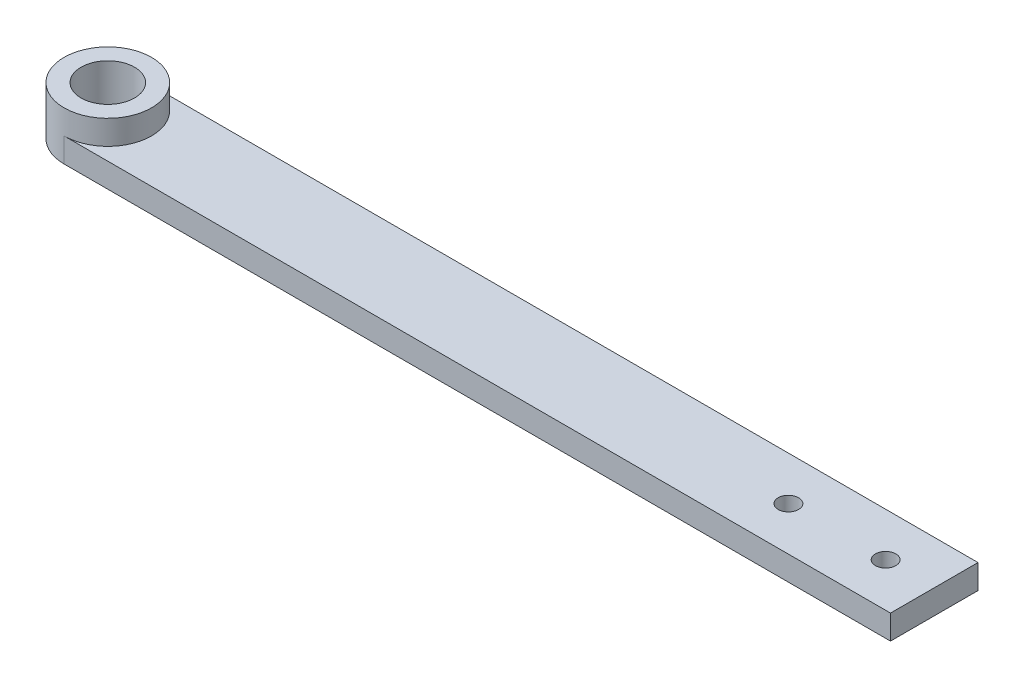
ISO-10303-21;
HEADER;
FILE_DESCRIPTION(('STEP AP214'),'2;1');
FILE_NAME('part.step','',(''),(''),'','','');
FILE_SCHEMA(('AUTOMOTIVE_DESIGN { 1 0 10303 214 1 1 1 1 }'));
ENDSEC;
DATA;
#1=APPLICATION_CONTEXT('core data for automotive mechanical design processes');
#2=APPLICATION_PROTOCOL_DEFINITION('international standard','automotive_design',2000,#1);
#3=PRODUCT_CONTEXT('',#1,'mechanical');
#4=PRODUCT('Part','Part','',(#3));
#5=PRODUCT_RELATED_PRODUCT_CATEGORY('part','',(#4));
#6=PRODUCT_DEFINITION_FORMATION('','',#4);
#7=PRODUCT_DEFINITION_CONTEXT('part definition',#1,'design');
#8=PRODUCT_DEFINITION('design','',#6,#7);
#9=PRODUCT_DEFINITION_SHAPE('','',#8);
#10=(LENGTH_UNIT() NAMED_UNIT(*) SI_UNIT(.MILLI.,.METRE.));
#11=(NAMED_UNIT(*) PLANE_ANGLE_UNIT() SI_UNIT($,.RADIAN.));
#12=(NAMED_UNIT(*) SI_UNIT($,.STERADIAN.) SOLID_ANGLE_UNIT());
#13=UNCERTAINTY_MEASURE_WITH_UNIT(LENGTH_MEASURE(1.E-05),#10,'distance_accuracy_value','');
#14=(GEOMETRIC_REPRESENTATION_CONTEXT(3) GLOBAL_UNCERTAINTY_ASSIGNED_CONTEXT((#13)) GLOBAL_UNIT_ASSIGNED_CONTEXT((#10,
#11,#12)) REPRESENTATION_CONTEXT('',''));
#15=CARTESIAN_POINT('',(0.,0.,0.));
#16=DIRECTION('',(0.,0.,1.));
#17=DIRECTION('',(1.,0.,0.));
#18=AXIS2_PLACEMENT_3D('',#15,#16,#17);
#19=CARTESIAN_POINT('',(0.,5.,18.));
#20=DIRECTION('',(-1.,0.,0.));
#21=DIRECTION('',(0.,0.,1.));
#22=AXIS2_PLACEMENT_3D('',#19,#20,#21);
#23=PLANE('',#22);
#24=DIRECTION('',(0.,0.,-1.));
#25=VECTOR('',#24,1.);
#26=CARTESIAN_POINT('',(0.,0.,18.));
#27=LINE('',#26,#25);
#28=CARTESIAN_POINT('',(0.,0.,18.));
#29=VERTEX_POINT('',#28);
#30=CARTESIAN_POINT('',(0.,0.,0.));
#31=VERTEX_POINT('',#30);
#32=EDGE_CURVE('E113',#29,#31,#27,.T.);
#33=ORIENTED_EDGE('',*,*,#32,.T.);
#34=DIRECTION('',(0.,-1.,0.));
#35=VECTOR('',#34,1.);
#36=CARTESIAN_POINT('',(0.,5.,0.));
#37=LINE('',#36,#35);
#38=CARTESIAN_POINT('',(0.,5.,0.));
#39=VERTEX_POINT('',#38);
#40=EDGE_CURVE('E11',#39,#31,#37,.T.);
#41=ORIENTED_EDGE('',*,*,#40,.F.);
#42=DIRECTION('',(0.,0.,-1.));
#43=VECTOR('',#42,1.);
#44=CARTESIAN_POINT('',(0.,5.,18.));
#45=LINE('',#44,#43);
#46=CARTESIAN_POINT('',(0.,5.,18.));
#47=VERTEX_POINT('',#46);
#48=EDGE_CURVE('E120',#47,#39,#45,.T.);
#49=ORIENTED_EDGE('',*,*,#48,.F.);
#50=DIRECTION('',(0.,-1.,0.));
#51=VECTOR('',#50,1.);
#52=CARTESIAN_POINT('',(0.,5.,18.));
#53=LINE('',#52,#51);
#54=EDGE_CURVE('E95',#47,#29,#53,.T.);
#55=ORIENTED_EDGE('',*,*,#54,.T.);
#56=EDGE_LOOP('',(#33,#41,#49,#55));
#57=FACE_BOUND('',#56,.T.);
#58=ADVANCED_FACE('F45',(#57),#23,.F.);
#59=CARTESIAN_POINT('',(0.,5.,0.));
#60=DIRECTION('',(0.,0.,1.));
#61=DIRECTION('',(1.,0.,0.));
#62=AXIS2_PLACEMENT_3D('',#59,#60,#61);
#63=PLANE('',#62);
#64=DIRECTION('',(-1.,0.,0.));
#65=VECTOR('',#64,1.);
#66=CARTESIAN_POINT('',(0.,0.,0.));
#67=LINE('',#66,#65);
#68=CARTESIAN_POINT('',(-170.,0.,0.));
#69=VERTEX_POINT('',#68);
#70=EDGE_CURVE('E128',#31,#69,#67,.T.);
#71=ORIENTED_EDGE('',*,*,#70,.T.);
#72=DIRECTION('',(0.,-1.,0.));
#73=VECTOR('',#72,1.);
#74=CARTESIAN_POINT('',(-170.,5.,0.));
#75=LINE('',#74,#73);
#76=CARTESIAN_POINT('',(-170.,5.,0.));
#77=VERTEX_POINT('',#76);
#78=EDGE_CURVE('E54',#77,#69,#75,.T.);
#79=ORIENTED_EDGE('',*,*,#78,.F.);
#80=DIRECTION('',(-1.,0.,0.));
#81=VECTOR('',#80,1.);
#82=CARTESIAN_POINT('',(0.,5.,0.));
#83=LINE('',#82,#81);
#84=EDGE_CURVE('E91',#39,#77,#83,.T.);
#85=ORIENTED_EDGE('',*,*,#84,.F.);
#86=ORIENTED_EDGE('',*,*,#40,.T.);
#87=EDGE_LOOP('',(#71,#79,#85,#86));
#88=FACE_BOUND('',#87,.T.);
#89=ADVANCED_FACE('F142',(#88),#63,.F.);
#90=CARTESIAN_POINT('',(-170.,5.,9.00000000000002));
#91=DIRECTION('',(0.,-1.,0.));
#92=DIRECTION('',(0.,0.,-1.));
#93=AXIS2_PLACEMENT_3D('',#90,#91,#92);
#94=CYLINDRICAL_SURFACE('',#93,9.);
#95=CARTESIAN_POINT('',(-170.,0.,9.00000000000002));
#96=DIRECTION('',(0.,1.,0.));
#97=DIRECTION('',(0.,0.,1.));
#98=AXIS2_PLACEMENT_3D('',#95,#96,#97);
#99=CIRCLE('',#98,9.);
#100=CARTESIAN_POINT('',(-170.,0.,18.));
#101=VERTEX_POINT('',#100);
#102=EDGE_CURVE('E81',#69,#101,#99,.T.);
#103=ORIENTED_EDGE('',*,*,#102,.T.);
#104=DIRECTION('',(0.,-1.,0.));
#105=VECTOR('',#104,1.);
#106=CARTESIAN_POINT('',(-170.,5.,18.));
#107=LINE('',#106,#105);
#108=CARTESIAN_POINT('',(-170.,5.,18.));
#109=VERTEX_POINT('',#108);
#110=EDGE_CURVE('E94',#109,#101,#107,.T.);
#111=ORIENTED_EDGE('',*,*,#110,.F.);
#112=CARTESIAN_POINT('',(-170.,5.,9.00000000000002));
#113=DIRECTION('',(0.,1.,0.));
#114=DIRECTION('',(0.,0.,1.));
#115=AXIS2_PLACEMENT_3D('',#112,#113,#114);
#116=CIRCLE('',#115,8.99999999999998);
#117=EDGE_CURVE('E102',#109,#77,#116,.T.);
#118=ORIENTED_EDGE('',*,*,#117,.T.);
#119=ORIENTED_EDGE('',*,*,#78,.T.);
#120=EDGE_LOOP('',(#103,#111,#118,#119));
#121=FACE_BOUND('',#120,.T.);
#122=CARTESIAN_POINT('',(-170.,10.,9.00000000000002));
#123=DIRECTION('',(0.,1.,0.));
#124=DIRECTION('',(0.,0.,1.));
#125=AXIS2_PLACEMENT_3D('',#122,#123,#124);
#126=CIRCLE('',#125,8.99999999999998);
#127=CARTESIAN_POINT('',(-170.,10.,18.));
#128=VERTEX_POINT('',#127);
#129=EDGE_CURVE('E107',#128,#128,#126,.T.);
#130=ORIENTED_EDGE('',*,*,#129,.F.);
#131=EDGE_LOOP('',(#130));
#132=FACE_BOUND('',#131,.T.);
#133=ADVANCED_FACE('F100',(#121,#132),#94,.T.);
#134=CARTESIAN_POINT('',(-170.,5.,18.));
#135=DIRECTION('',(0.,0.,-1.));
#136=DIRECTION('',(-1.,0.,0.));
#137=AXIS2_PLACEMENT_3D('',#134,#135,#136);
#138=PLANE('',#137);
#139=DIRECTION('',(1.,0.,0.));
#140=VECTOR('',#139,1.);
#141=CARTESIAN_POINT('',(-170.,0.,18.));
#142=LINE('',#141,#140);
#143=EDGE_CURVE('E86',#101,#29,#142,.T.);
#144=ORIENTED_EDGE('',*,*,#143,.T.);
#145=ORIENTED_EDGE('',*,*,#54,.F.);
#146=DIRECTION('',(1.,0.,0.));
#147=VECTOR('',#146,1.);
#148=CARTESIAN_POINT('',(-170.,5.,18.));
#149=LINE('',#148,#147);
#150=EDGE_CURVE('E62',#109,#47,#149,.T.);
#151=ORIENTED_EDGE('',*,*,#150,.F.);
#152=ORIENTED_EDGE('',*,*,#110,.T.);
#153=EDGE_LOOP('',(#144,#145,#151,#152));
#154=FACE_BOUND('',#153,.T.);
#155=ADVANCED_FACE('F93',(#154),#138,.F.);
#156=CARTESIAN_POINT('',(-170.,5.,9.00000000000002));
#157=DIRECTION('',(0.,1.,0.));
#158=DIRECTION('',(0.,0.,1.));
#159=AXIS2_PLACEMENT_3D('',#156,#157,#158);
#160=PLANE('',#159);
#161=CARTESIAN_POINT('',(-10.,5.,9.));
#162=DIRECTION('',(0.,1.,0.));
#163=DIRECTION('',(0.,0.,1.));
#164=AXIS2_PLACEMENT_3D('',#161,#162,#163);
#165=CIRCLE('',#164,2.1);
#166=CARTESIAN_POINT('',(-10.,5.,11.1));
#167=VERTEX_POINT('',#166);
#168=EDGE_CURVE('E181',#167,#167,#165,.T.);
#169=ORIENTED_EDGE('',*,*,#168,.F.);
#170=EDGE_LOOP('',(#169));
#171=FACE_BOUND('',#170,.T.);
#172=CARTESIAN_POINT('',(-30.,5.,9.));
#173=DIRECTION('',(0.,1.,0.));
#174=DIRECTION('',(0.,0.,1.));
#175=AXIS2_PLACEMENT_3D('',#172,#173,#174);
#176=CIRCLE('',#175,2.1);
#177=CARTESIAN_POINT('',(-30.,5.,11.1));
#178=VERTEX_POINT('',#177);
#179=EDGE_CURVE('E183',#178,#178,#176,.T.);
#180=ORIENTED_EDGE('',*,*,#179,.F.);
#181=EDGE_LOOP('',(#180));
#182=FACE_BOUND('',#181,.T.);
#183=ORIENTED_EDGE('',*,*,#117,.F.);
#184=ORIENTED_EDGE('',*,*,#150,.T.);
#185=ORIENTED_EDGE('',*,*,#48,.T.);
#186=ORIENTED_EDGE('',*,*,#84,.T.);
#187=EDGE_LOOP('',(#183,#184,#185,#186));
#188=FACE_BOUND('',#187,.T.);
#189=ADVANCED_FACE('F105',(#171,#182,#188),#160,.T.);
#190=CARTESIAN_POINT('',(-170.,0.,9.00000000000002));
#191=DIRECTION('',(0.,1.,0.));
#192=DIRECTION('',(0.,0.,1.));
#193=AXIS2_PLACEMENT_3D('',#190,#191,#192);
#194=PLANE('',#193);
#195=CARTESIAN_POINT('',(-10.,0.,9.));
#196=DIRECTION('',(0.,1.,0.));
#197=DIRECTION('',(0.,0.,1.));
#198=AXIS2_PLACEMENT_3D('',#195,#196,#197);
#199=CIRCLE('',#198,2.1);
#200=CARTESIAN_POINT('',(-10.,0.,11.1));
#201=VERTEX_POINT('',#200);
#202=EDGE_CURVE('E178',#201,#201,#199,.T.);
#203=ORIENTED_EDGE('',*,*,#202,.T.);
#204=EDGE_LOOP('',(#203));
#205=FACE_BOUND('',#204,.T.);
#206=CARTESIAN_POINT('',(-30.,0.,9.));
#207=DIRECTION('',(0.,1.,0.));
#208=DIRECTION('',(0.,0.,1.));
#209=AXIS2_PLACEMENT_3D('',#206,#207,#208);
#210=CIRCLE('',#209,2.1);
#211=CARTESIAN_POINT('',(-30.,0.,11.1));
#212=VERTEX_POINT('',#211);
#213=EDGE_CURVE('E189',#212,#212,#210,.T.);
#214=ORIENTED_EDGE('',*,*,#213,.T.);
#215=EDGE_LOOP('',(#214));
#216=FACE_BOUND('',#215,.T.);
#217=CARTESIAN_POINT('',(-170.,0.,9.00000000000002));
#218=DIRECTION('',(0.,1.,0.));
#219=DIRECTION('',(0.,0.,1.));
#220=AXIS2_PLACEMENT_3D('',#217,#218,#219);
#221=CIRCLE('',#220,5.50000000000002);
#222=CARTESIAN_POINT('',(-170.,0.,14.5));
#223=VERTEX_POINT('',#222);
#224=EDGE_CURVE('E108',#223,#223,#221,.T.);
#225=ORIENTED_EDGE('',*,*,#224,.T.);
#226=EDGE_LOOP('',(#225));
#227=FACE_BOUND('',#226,.T.);
#228=ORIENTED_EDGE('',*,*,#32,.F.);
#229=ORIENTED_EDGE('',*,*,#143,.F.);
#230=ORIENTED_EDGE('',*,*,#102,.F.);
#231=ORIENTED_EDGE('',*,*,#70,.F.);
#232=EDGE_LOOP('',(#228,#229,#230,#231));
#233=FACE_BOUND('',#232,.T.);
#234=ADVANCED_FACE('F139',(#205,#216,#227,#233),#194,.F.);
#235=CARTESIAN_POINT('',(-170.,10.,9.00000000000002));
#236=DIRECTION('',(0.,1.,0.));
#237=DIRECTION('',(0.,0.,1.));
#238=AXIS2_PLACEMENT_3D('',#235,#236,#237);
#239=PLANE('',#238);
#240=CARTESIAN_POINT('',(-170.,10.,9.00000000000002));
#241=DIRECTION('',(0.,1.,0.));
#242=DIRECTION('',(0.,0.,1.));
#243=AXIS2_PLACEMENT_3D('',#240,#241,#242);
#244=CIRCLE('',#243,5.50000000000002);
#245=CARTESIAN_POINT('',(-170.,10.,14.5));
#246=VERTEX_POINT('',#245);
#247=EDGE_CURVE('E116',#246,#246,#244,.T.);
#248=ORIENTED_EDGE('',*,*,#247,.F.);
#249=EDGE_LOOP('',(#248));
#250=FACE_BOUND('',#249,.T.);
#251=ORIENTED_EDGE('',*,*,#129,.T.);
#252=EDGE_LOOP('',(#251));
#253=FACE_BOUND('',#252,.T.);
#254=ADVANCED_FACE('F154',(#250,#253),#239,.T.);
#255=CARTESIAN_POINT('',(-170.,0.,9.00000000000002));
#256=DIRECTION('',(0.,1.,0.));
#257=DIRECTION('',(0.,0.,1.));
#258=AXIS2_PLACEMENT_3D('',#255,#256,#257);
#259=CYLINDRICAL_SURFACE('',#258,5.50000000000002);
#260=ORIENTED_EDGE('',*,*,#224,.F.);
#261=EDGE_LOOP('',(#260));
#262=FACE_BOUND('',#261,.T.);
#263=ORIENTED_EDGE('',*,*,#247,.T.);
#264=EDGE_LOOP('',(#263));
#265=FACE_BOUND('',#264,.T.);
#266=ADVANCED_FACE('F161',(#262,#265),#259,.F.);
#267=CARTESIAN_POINT('',(-30.,0.,9.));
#268=DIRECTION('',(0.,1.,0.));
#269=DIRECTION('',(0.,0.,1.));
#270=AXIS2_PLACEMENT_3D('',#267,#268,#269);
#271=CYLINDRICAL_SURFACE('',#270,2.1);
#272=ORIENTED_EDGE('',*,*,#213,.F.);
#273=EDGE_LOOP('',(#272));
#274=FACE_BOUND('',#273,.T.);
#275=ORIENTED_EDGE('',*,*,#179,.T.);
#276=EDGE_LOOP('',(#275));
#277=FACE_BOUND('',#276,.T.);
#278=ADVANCED_FACE('F165',(#274,#277),#271,.F.);
#279=CARTESIAN_POINT('',(-10.,0.,9.));
#280=DIRECTION('',(0.,1.,0.));
#281=DIRECTION('',(0.,0.,1.));
#282=AXIS2_PLACEMENT_3D('',#279,#280,#281);
#283=CYLINDRICAL_SURFACE('',#282,2.1);
#284=ORIENTED_EDGE('',*,*,#202,.F.);
#285=EDGE_LOOP('',(#284));
#286=FACE_BOUND('',#285,.T.);
#287=ORIENTED_EDGE('',*,*,#168,.T.);
#288=EDGE_LOOP('',(#287));
#289=FACE_BOUND('',#288,.T.);
#290=ADVANCED_FACE('F169',(#286,#289),#283,.F.);
#291=CLOSED_SHELL('',(#58,#89,#133,#155,#189,#234,#254,#266,#278,#290));
#292=MANIFOLD_SOLID_BREP('B2',#291);
#293=ADVANCED_BREP_SHAPE_REPRESENTATION('',(#18,#292),#14);
#294=SHAPE_DEFINITION_REPRESENTATION(#9,#293);
ENDSEC;
END-ISO-10303-21;
